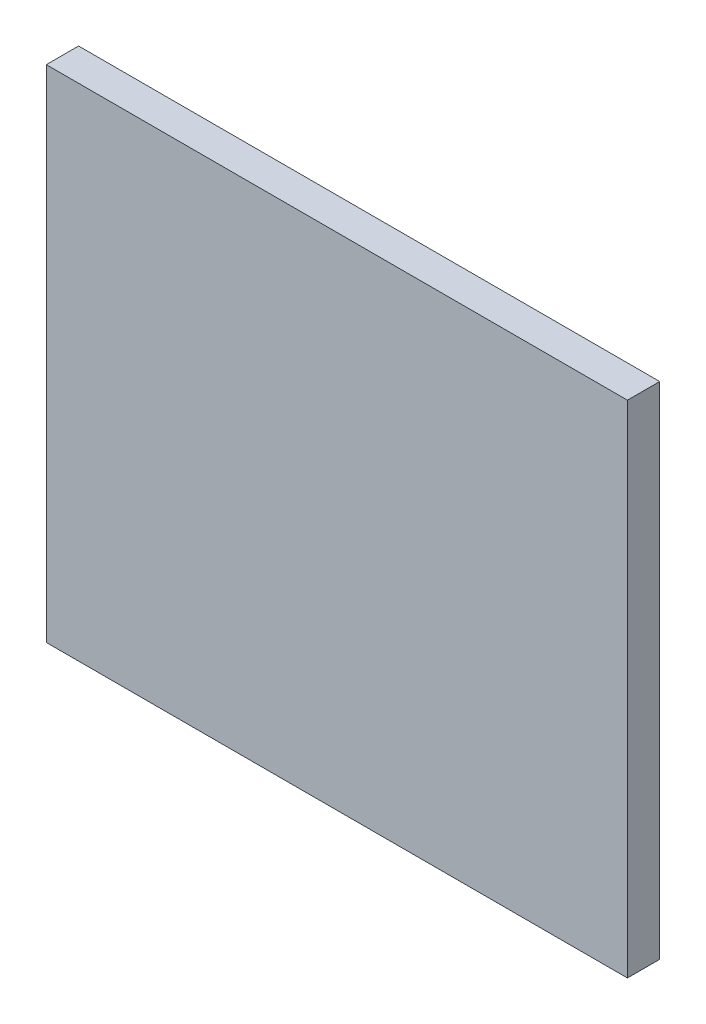
ISO-10303-21;
HEADER;
FILE_DESCRIPTION(('STEP AP214'),'2;1');
FILE_NAME('part.step','',(''),(''),'','','');
FILE_SCHEMA(('AUTOMOTIVE_DESIGN { 1 0 10303 214 1 1 1 1 }'));
ENDSEC;
DATA;
#1=APPLICATION_CONTEXT('core data for automotive mechanical design processes');
#2=APPLICATION_PROTOCOL_DEFINITION('international standard','automotive_design',2000,#1);
#3=PRODUCT_CONTEXT('',#1,'mechanical');
#4=PRODUCT('Part','Part','',(#3));
#5=PRODUCT_RELATED_PRODUCT_CATEGORY('part','',(#4));
#6=PRODUCT_DEFINITION_FORMATION('','',#4);
#7=PRODUCT_DEFINITION_CONTEXT('part definition',#1,'design');
#8=PRODUCT_DEFINITION('design','',#6,#7);
#9=PRODUCT_DEFINITION_SHAPE('','',#8);
#10=(LENGTH_UNIT() NAMED_UNIT(*) SI_UNIT(.MILLI.,.METRE.));
#11=(NAMED_UNIT(*) PLANE_ANGLE_UNIT() SI_UNIT($,.RADIAN.));
#12=(NAMED_UNIT(*) SI_UNIT($,.STERADIAN.) SOLID_ANGLE_UNIT());
#13=UNCERTAINTY_MEASURE_WITH_UNIT(LENGTH_MEASURE(1.E-05),#10,'distance_accuracy_value','');
#14=(GEOMETRIC_REPRESENTATION_CONTEXT(3) GLOBAL_UNCERTAINTY_ASSIGNED_CONTEXT((#13)) GLOBAL_UNIT_ASSIGNED_CONTEXT((#10,
#11,#12)) REPRESENTATION_CONTEXT('',''));
#15=CARTESIAN_POINT('',(0.,0.,0.));
#16=DIRECTION('',(0.,0.,1.));
#17=DIRECTION('',(1.,0.,0.));
#18=AXIS2_PLACEMENT_3D('',#15,#16,#17);
#19=CARTESIAN_POINT('',(0.,0.,2.));
#20=DIRECTION('',(1.,0.,0.));
#21=DIRECTION('',(0.,0.,-1.));
#22=AXIS2_PLACEMENT_3D('',#19,#20,#21);
#23=PLANE('',#22);
#24=DIRECTION('',(0.,-1.,0.));
#25=VECTOR('',#24,1.);
#26=CARTESIAN_POINT('',(0.,0.,0.));
#27=LINE('',#26,#25);
#28=CARTESIAN_POINT('',(0.,31.,0.));
#29=VERTEX_POINT('',#28);
#30=CARTESIAN_POINT('',(0.,0.,0.));
#31=VERTEX_POINT('',#30);
#32=EDGE_CURVE('E108',#29,#31,#27,.T.);
#33=ORIENTED_EDGE('',*,*,#32,.T.);
#34=DIRECTION('',(0.,0.,-1.));
#35=VECTOR('',#34,1.);
#36=CARTESIAN_POINT('',(0.,0.,2.));
#37=LINE('',#36,#35);
#38=CARTESIAN_POINT('',(0.,0.,2.));
#39=VERTEX_POINT('',#38);
#40=EDGE_CURVE('E11',#39,#31,#37,.T.);
#41=ORIENTED_EDGE('',*,*,#40,.F.);
#42=DIRECTION('',(0.,-1.,0.));
#43=VECTOR('',#42,1.);
#44=CARTESIAN_POINT('',(0.,0.,2.));
#45=LINE('',#44,#43);
#46=CARTESIAN_POINT('',(0.,31.,2.));
#47=VERTEX_POINT('',#46);
#48=EDGE_CURVE('E92',#47,#39,#45,.T.);
#49=ORIENTED_EDGE('',*,*,#48,.F.);
#50=DIRECTION('',(0.,0.,-1.));
#51=VECTOR('',#50,1.);
#52=CARTESIAN_POINT('',(0.,31.,2.));
#53=LINE('',#52,#51);
#54=EDGE_CURVE('E105',#47,#29,#53,.T.);
#55=ORIENTED_EDGE('',*,*,#54,.T.);
#56=EDGE_LOOP('',(#33,#41,#49,#55));
#57=FACE_BOUND('',#56,.T.);
#58=ADVANCED_FACE('F43',(#57),#23,.F.);
#59=CARTESIAN_POINT('',(0.,0.,2.));
#60=DIRECTION('',(0.,1.,0.));
#61=DIRECTION('',(0.,0.,1.));
#62=AXIS2_PLACEMENT_3D('',#59,#60,#61);
#63=PLANE('',#62);
#64=DIRECTION('',(1.,0.,0.));
#65=VECTOR('',#64,1.);
#66=CARTESIAN_POINT('',(0.,0.,0.));
#67=LINE('',#66,#65);
#68=CARTESIAN_POINT('',(36.,0.,0.));
#69=VERTEX_POINT('',#68);
#70=EDGE_CURVE('E97',#31,#69,#67,.T.);
#71=ORIENTED_EDGE('',*,*,#70,.T.);
#72=DIRECTION('',(0.,0.,-1.));
#73=VECTOR('',#72,1.);
#74=CARTESIAN_POINT('',(36.,0.,2.));
#75=LINE('',#74,#73);
#76=CARTESIAN_POINT('',(36.,0.,2.));
#77=VERTEX_POINT('',#76);
#78=EDGE_CURVE('E51',#77,#69,#75,.T.);
#79=ORIENTED_EDGE('',*,*,#78,.F.);
#80=DIRECTION('',(1.,0.,0.));
#81=VECTOR('',#80,1.);
#82=CARTESIAN_POINT('',(0.,0.,2.));
#83=LINE('',#82,#81);
#84=EDGE_CURVE('E87',#39,#77,#83,.T.);
#85=ORIENTED_EDGE('',*,*,#84,.F.);
#86=ORIENTED_EDGE('',*,*,#40,.T.);
#87=EDGE_LOOP('',(#71,#79,#85,#86));
#88=FACE_BOUND('',#87,.T.);
#89=ADVANCED_FACE('F100',(#88),#63,.F.);
#90=CARTESIAN_POINT('',(36.,0.,2.));
#91=DIRECTION('',(-1.,0.,0.));
#92=DIRECTION('',(0.,0.,1.));
#93=AXIS2_PLACEMENT_3D('',#90,#91,#92);
#94=PLANE('',#93);
#95=DIRECTION('',(0.,1.,0.));
#96=VECTOR('',#95,1.);
#97=CARTESIAN_POINT('',(36.,0.,0.));
#98=LINE('',#97,#96);
#99=CARTESIAN_POINT('',(36.,31.,0.));
#100=VERTEX_POINT('',#99);
#101=EDGE_CURVE('E78',#69,#100,#98,.T.);
#102=ORIENTED_EDGE('',*,*,#101,.T.);
#103=DIRECTION('',(0.,0.,-1.));
#104=VECTOR('',#103,1.);
#105=CARTESIAN_POINT('',(36.,31.,2.));
#106=LINE('',#105,#104);
#107=CARTESIAN_POINT('',(36.,31.,2.));
#108=VERTEX_POINT('',#107);
#109=EDGE_CURVE('E98',#108,#100,#106,.T.);
#110=ORIENTED_EDGE('',*,*,#109,.F.);
#111=DIRECTION('',(0.,1.,0.));
#112=VECTOR('',#111,1.);
#113=CARTESIAN_POINT('',(36.,0.,2.));
#114=LINE('',#113,#112);
#115=EDGE_CURVE('E95',#77,#108,#114,.T.);
#116=ORIENTED_EDGE('',*,*,#115,.F.);
#117=ORIENTED_EDGE('',*,*,#78,.T.);
#118=EDGE_LOOP('',(#102,#110,#116,#117));
#119=FACE_BOUND('',#118,.T.);
#120=ADVANCED_FACE('F99',(#119),#94,.F.);
#121=CARTESIAN_POINT('',(0.,31.,2.));
#122=DIRECTION('',(0.,-1.,0.));
#123=DIRECTION('',(0.,0.,-1.));
#124=AXIS2_PLACEMENT_3D('',#121,#122,#123);
#125=PLANE('',#124);
#126=DIRECTION('',(-1.,0.,0.));
#127=VECTOR('',#126,1.);
#128=CARTESIAN_POINT('',(0.,31.,0.));
#129=LINE('',#128,#127);
#130=EDGE_CURVE('E85',#100,#29,#129,.T.);
#131=ORIENTED_EDGE('',*,*,#130,.T.);
#132=ORIENTED_EDGE('',*,*,#54,.F.);
#133=DIRECTION('',(-1.,0.,0.));
#134=VECTOR('',#133,1.);
#135=CARTESIAN_POINT('',(0.,31.,2.));
#136=LINE('',#135,#134);
#137=EDGE_CURVE('E56',#108,#47,#136,.T.);
#138=ORIENTED_EDGE('',*,*,#137,.F.);
#139=ORIENTED_EDGE('',*,*,#109,.T.);
#140=EDGE_LOOP('',(#131,#132,#138,#139));
#141=FACE_BOUND('',#140,.T.);
#142=ADVANCED_FACE('F111',(#141),#125,.F.);
#143=CARTESIAN_POINT('',(0.,0.,2.));
#144=DIRECTION('',(0.,0.,-1.));
#145=DIRECTION('',(-1.,0.,0.));
#146=AXIS2_PLACEMENT_3D('',#143,#144,#145);
#147=PLANE('',#146);
#148=ORIENTED_EDGE('',*,*,#48,.T.);
#149=ORIENTED_EDGE('',*,*,#84,.T.);
#150=ORIENTED_EDGE('',*,*,#115,.T.);
#151=ORIENTED_EDGE('',*,*,#137,.T.);
#152=EDGE_LOOP('',(#148,#149,#150,#151));
#153=FACE_BOUND('',#152,.T.);
#154=ADVANCED_FACE('F89',(#153),#147,.F.);
#155=CARTESIAN_POINT('',(0.,0.,0.));
#156=DIRECTION('',(0.,0.,-1.));
#157=DIRECTION('',(-1.,0.,0.));
#158=AXIS2_PLACEMENT_3D('',#155,#156,#157);
#159=PLANE('',#158);
#160=ORIENTED_EDGE('',*,*,#32,.F.);
#161=ORIENTED_EDGE('',*,*,#130,.F.);
#162=ORIENTED_EDGE('',*,*,#101,.F.);
#163=ORIENTED_EDGE('',*,*,#70,.F.);
#164=EDGE_LOOP('',(#160,#161,#162,#163));
#165=FACE_BOUND('',#164,.T.);
#166=ADVANCED_FACE('F118',(#165),#159,.T.);
#167=CLOSED_SHELL('',(#58,#89,#120,#142,#154,#166));
#168=MANIFOLD_SOLID_BREP('B2',#167);
#169=ADVANCED_BREP_SHAPE_REPRESENTATION('',(#18,#168),#14);
#170=SHAPE_DEFINITION_REPRESENTATION(#9,#169);
ENDSEC;
END-ISO-10303-21;
